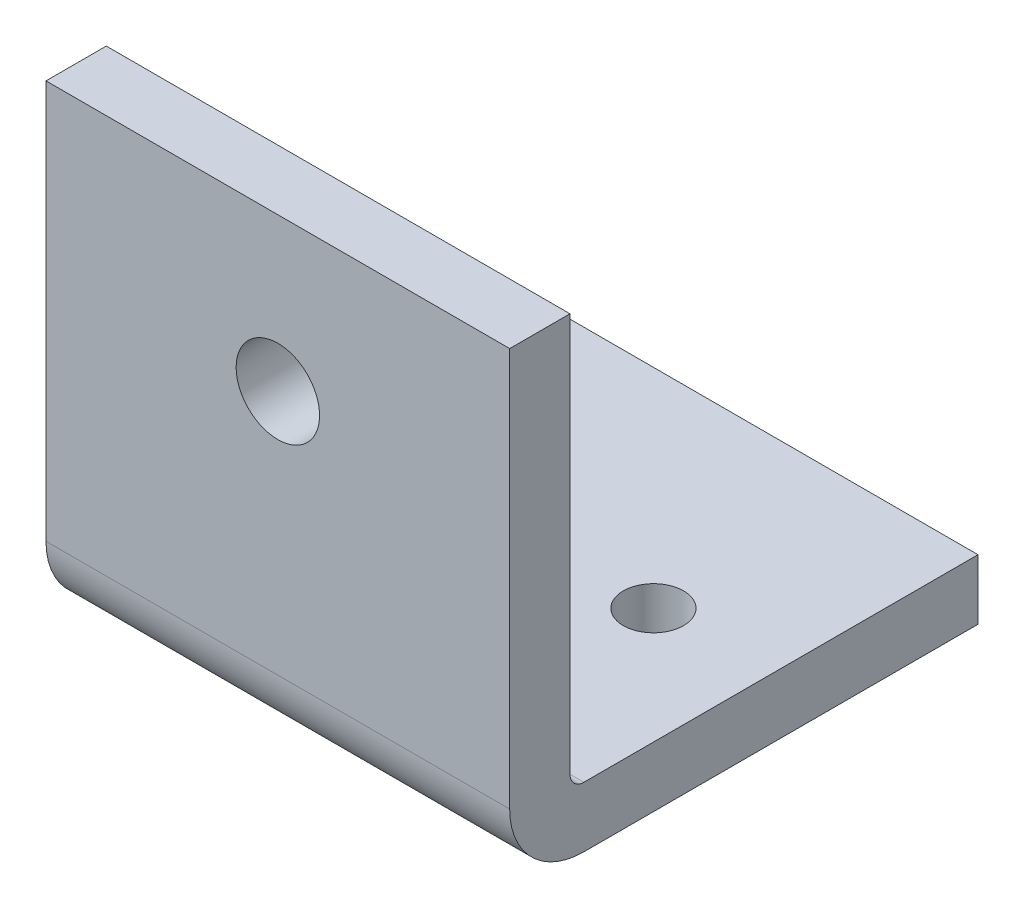
ISO-10303-21;
HEADER;
FILE_DESCRIPTION(('STEP AP214'),'2;1');
FILE_NAME('part.step','',(''),(''),'','','');
FILE_SCHEMA(('AUTOMOTIVE_DESIGN { 1 0 10303 214 1 1 1 1 }'));
ENDSEC;
DATA;
#1=APPLICATION_CONTEXT('core data for automotive mechanical design processes');
#2=APPLICATION_PROTOCOL_DEFINITION('international standard','automotive_design',2000,#1);
#3=PRODUCT_CONTEXT('',#1,'mechanical');
#4=PRODUCT('Part','Part','',(#3));
#5=PRODUCT_RELATED_PRODUCT_CATEGORY('part','',(#4));
#6=PRODUCT_DEFINITION_FORMATION('','',#4);
#7=PRODUCT_DEFINITION_CONTEXT('part definition',#1,'design');
#8=PRODUCT_DEFINITION('design','',#6,#7);
#9=PRODUCT_DEFINITION_SHAPE('','',#8);
#10=(LENGTH_UNIT() NAMED_UNIT(*) SI_UNIT(.MILLI.,.METRE.));
#11=(NAMED_UNIT(*) PLANE_ANGLE_UNIT() SI_UNIT($,.RADIAN.));
#12=(NAMED_UNIT(*) SI_UNIT($,.STERADIAN.) SOLID_ANGLE_UNIT());
#13=UNCERTAINTY_MEASURE_WITH_UNIT(LENGTH_MEASURE(1.E-05),#10,'distance_accuracy_value','');
#14=(GEOMETRIC_REPRESENTATION_CONTEXT(3) GLOBAL_UNCERTAINTY_ASSIGNED_CONTEXT((#13)) GLOBAL_UNIT_ASSIGNED_CONTEXT((#10,
#11,#12)) REPRESENTATION_CONTEXT('',''));
#15=CARTESIAN_POINT('',(0.,0.,0.));
#16=DIRECTION('',(0.,0.,1.));
#17=DIRECTION('',(1.,0.,0.));
#18=AXIS2_PLACEMENT_3D('',#15,#16,#17);
#19=CARTESIAN_POINT('',(50.,16.,-16.));
#20=DIRECTION('',(-1.,0.,0.));
#21=DIRECTION('',(0.,0.,1.));
#22=AXIS2_PLACEMENT_3D('',#19,#20,#21);
#23=CYLINDRICAL_SURFACE('',#22,3.);
#24=DIRECTION('',(-1.,0.,0.));
#25=VECTOR('',#24,1.);
#26=CARTESIAN_POINT('',(50.,13.,-16.));
#27=LINE('',#26,#25);
#28=CARTESIAN_POINT('',(22.5,13.,-16.));
#29=VERTEX_POINT('',#28);
#30=CARTESIAN_POINT('',(-22.5,13.,-16.));
#31=VERTEX_POINT('',#30);
#32=EDGE_CURVE('E322',#29,#31,#27,.T.);
#33=ORIENTED_EDGE('',*,*,#32,.T.);
#34=CARTESIAN_POINT('',(-22.5,16.,-16.));
#35=DIRECTION('',(-1.,0.,0.));
#36=DIRECTION('',(0.,0.,1.));
#37=AXIS2_PLACEMENT_3D('',#34,#35,#36);
#38=CIRCLE('',#37,3.);
#39=CARTESIAN_POINT('',(-22.5,16.,-13.));
#40=VERTEX_POINT('',#39);
#41=EDGE_CURVE('E153',#31,#40,#38,.T.);
#42=ORIENTED_EDGE('',*,*,#41,.T.);
#43=DIRECTION('',(-1.,0.,0.));
#44=VECTOR('',#43,1.);
#45=CARTESIAN_POINT('',(50.,16.,-13.));
#46=LINE('',#45,#44);
#47=CARTESIAN_POINT('',(22.5,16.,-13.));
#48=VERTEX_POINT('',#47);
#49=EDGE_CURVE('E318',#48,#40,#46,.T.);
#50=ORIENTED_EDGE('',*,*,#49,.F.);
#51=CARTESIAN_POINT('',(22.5,16.,-16.));
#52=DIRECTION('',(1.,0.,0.));
#53=DIRECTION('',(0.,0.,-1.));
#54=AXIS2_PLACEMENT_3D('',#51,#52,#53);
#55=CIRCLE('',#54,3.);
#56=EDGE_CURVE('E63',#48,#29,#55,.T.);
#57=ORIENTED_EDGE('',*,*,#56,.T.);
#58=EDGE_LOOP('',(#33,#42,#50,#57));
#59=FACE_BOUND('',#58,.T.);
#60=ADVANCED_FACE('F39',(#59),#23,.F.);
#61=CARTESIAN_POINT('',(-27.5,16.,-16.));
#62=DIRECTION('',(-1.,0.,0.));
#63=DIRECTION('',(0.,0.,1.));
#64=AXIS2_PLACEMENT_3D('',#61,#62,#63);
#65=CIRCLE('',#64,3.);
#66=CARTESIAN_POINT('',(-27.5,13.,-16.));
#67=VERTEX_POINT('',#66);
#68=CARTESIAN_POINT('',(-27.5,16.,-13.));
#69=VERTEX_POINT('',#68);
#70=EDGE_CURVE('E340',#67,#69,#65,.T.);
#71=ORIENTED_EDGE('',*,*,#70,.F.);
#72=CARTESIAN_POINT('',(-50.,13.,-16.));
#73=VERTEX_POINT('',#72);
#74=EDGE_CURVE('E317',#67,#73,#27,.T.);
#75=ORIENTED_EDGE('',*,*,#74,.T.);
#76=CARTESIAN_POINT('',(-50.,16.,-16.));
#77=DIRECTION('',(1.,0.,0.));
#78=DIRECTION('',(0.,0.,-1.));
#79=AXIS2_PLACEMENT_3D('',#76,#77,#78);
#80=CIRCLE('',#79,3.);
#81=CARTESIAN_POINT('',(-50.,16.,-13.));
#82=VERTEX_POINT('',#81);
#83=EDGE_CURVE('E282',#82,#73,#80,.T.);
#84=ORIENTED_EDGE('',*,*,#83,.F.);
#85=EDGE_CURVE('E312',#69,#82,#46,.T.);
#86=ORIENTED_EDGE('',*,*,#85,.F.);
#87=EDGE_LOOP('',(#71,#75,#84,#86));
#88=FACE_BOUND('',#87,.T.);
#89=ADVANCED_FACE('F339',(#88),#23,.F.);
#90=CARTESIAN_POINT('',(50.,0.,-16.));
#91=DIRECTION('',(0.,1.,0.));
#92=DIRECTION('',(0.,0.,1.));
#93=AXIS2_PLACEMENT_3D('',#90,#91,#92);
#94=PLANE('',#93);
#95=DIRECTION('',(-1.,0.,0.));
#96=VECTOR('',#95,1.);
#97=CARTESIAN_POINT('',(50.,0.,-16.));
#98=LINE('',#97,#96);
#99=CARTESIAN_POINT('',(50.,0.,-16.));
#100=VERTEX_POINT('',#99);
#101=CARTESIAN_POINT('',(-50.,0.,-16.));
#102=VERTEX_POINT('',#101);
#103=EDGE_CURVE('E270',#100,#102,#98,.T.);
#104=ORIENTED_EDGE('',*,*,#103,.T.);
#105=DIRECTION('',(0.,0.,-1.));
#106=VECTOR('',#105,1.);
#107=CARTESIAN_POINT('',(-50.,0.,-16.));
#108=LINE('',#107,#106);
#109=CARTESIAN_POINT('',(-50.,0.,-101.));
#110=VERTEX_POINT('',#109);
#111=EDGE_CURVE('E228',#102,#110,#108,.T.);
#112=ORIENTED_EDGE('',*,*,#111,.T.);
#113=DIRECTION('',(-1.,0.,0.));
#114=VECTOR('',#113,1.);
#115=CARTESIAN_POINT('',(50.,0.,-101.));
#116=LINE('',#115,#114);
#117=CARTESIAN_POINT('',(50.,0.,-101.));
#118=VERTEX_POINT('',#117);
#119=EDGE_CURVE('E11',#118,#110,#116,.T.);
#120=ORIENTED_EDGE('',*,*,#119,.F.);
#121=DIRECTION('',(0.,0.,-1.));
#122=VECTOR('',#121,1.);
#123=CARTESIAN_POINT('',(50.,0.,-16.));
#124=LINE('',#123,#122);
#125=EDGE_CURVE('E240',#100,#118,#124,.T.);
#126=ORIENTED_EDGE('',*,*,#125,.F.);
#127=EDGE_LOOP('',(#104,#112,#120,#126));
#128=FACE_BOUND('',#127,.T.);
#129=CARTESIAN_POINT('',(-25.,0.,-56.));
#130=DIRECTION('',(0.,1.,0.));
#131=DIRECTION('',(0.,0.,1.));
#132=AXIS2_PLACEMENT_3D('',#129,#130,#131);
#133=CIRCLE('',#132,6.5);
#134=CARTESIAN_POINT('',(-25.,0.,-49.5));
#135=VERTEX_POINT('',#134);
#136=EDGE_CURVE('E224',#135,#135,#133,.T.);
#137=ORIENTED_EDGE('',*,*,#136,.T.);
#138=EDGE_LOOP('',(#137));
#139=FACE_BOUND('',#138,.T.);
#140=CARTESIAN_POINT('',(25.,0.,-56.));
#141=DIRECTION('',(0.,1.,0.));
#142=DIRECTION('',(0.,0.,1.));
#143=AXIS2_PLACEMENT_3D('',#140,#141,#142);
#144=CIRCLE('',#143,6.5);
#145=CARTESIAN_POINT('',(25.,0.,-49.5));
#146=VERTEX_POINT('',#145);
#147=EDGE_CURVE('E233',#146,#146,#144,.T.);
#148=ORIENTED_EDGE('',*,*,#147,.T.);
#149=EDGE_LOOP('',(#148));
#150=FACE_BOUND('',#149,.T.);
#151=ADVANCED_FACE('F41',(#128,#139,#150),#94,.F.);
#152=CARTESIAN_POINT('',(50.,13.,-101.));
#153=DIRECTION('',(0.,0.,-1.));
#154=DIRECTION('',(-1.,0.,0.));
#155=AXIS2_PLACEMENT_3D('',#152,#153,#154);
#156=PLANE('',#155);
#157=DIRECTION('',(0.,-1.,0.));
#158=VECTOR('',#157,1.);
#159=CARTESIAN_POINT('',(-50.,13.,-101.));
#160=LINE('',#159,#158);
#161=CARTESIAN_POINT('',(-50.,13.,-101.));
#162=VERTEX_POINT('',#161);
#163=EDGE_CURVE('E274',#162,#110,#160,.T.);
#164=ORIENTED_EDGE('',*,*,#163,.F.);
#165=DIRECTION('',(-1.,0.,0.));
#166=VECTOR('',#165,1.);
#167=CARTESIAN_POINT('',(50.,13.,-101.));
#168=LINE('',#167,#166);
#169=CARTESIAN_POINT('',(50.,13.,-101.));
#170=VERTEX_POINT('',#169);
#171=EDGE_CURVE('E48',#170,#162,#168,.T.);
#172=ORIENTED_EDGE('',*,*,#171,.F.);
#173=DIRECTION('',(0.,-1.,0.));
#174=VECTOR('',#173,1.);
#175=CARTESIAN_POINT('',(50.,13.,-101.));
#176=LINE('',#175,#174);
#177=EDGE_CURVE('E243',#170,#118,#176,.T.);
#178=ORIENTED_EDGE('',*,*,#177,.T.);
#179=ORIENTED_EDGE('',*,*,#119,.T.);
#180=EDGE_LOOP('',(#164,#172,#178,#179));
#181=FACE_BOUND('',#180,.T.);
#182=ADVANCED_FACE('F329',(#181),#156,.T.);
#183=CARTESIAN_POINT('',(50.,13.,-16.));
#184=DIRECTION('',(0.,1.,0.));
#185=DIRECTION('',(0.,0.,1.));
#186=AXIS2_PLACEMENT_3D('',#183,#184,#185);
#187=PLANE('',#186);
#188=DIRECTION('',(0.,0.,1.));
#189=VECTOR('',#188,1.);
#190=CARTESIAN_POINT('',(-27.5,13.,-16.));
#191=LINE('',#190,#189);
#192=CARTESIAN_POINT('',(-27.5,13.,-33.));
#193=VERTEX_POINT('',#192);
#194=EDGE_CURVE('E176',#193,#67,#191,.T.);
#195=ORIENTED_EDGE('',*,*,#194,.F.);
#196=DIRECTION('',(-1.,0.,0.));
#197=VECTOR('',#196,1.);
#198=CARTESIAN_POINT('',(50.,13.,-33.));
#199=LINE('',#198,#197);
#200=CARTESIAN_POINT('',(-22.5,13.,-33.));
#201=VERTEX_POINT('',#200);
#202=EDGE_CURVE('E164',#201,#193,#199,.T.);
#203=ORIENTED_EDGE('',*,*,#202,.F.);
#204=DIRECTION('',(0.,0.,1.));
#205=VECTOR('',#204,1.);
#206=CARTESIAN_POINT('',(-22.5,13.,-16.));
#207=LINE('',#206,#205);
#208=EDGE_CURVE('E150',#201,#31,#207,.T.);
#209=ORIENTED_EDGE('',*,*,#208,.T.);
#210=ORIENTED_EDGE('',*,*,#32,.F.);
#211=DIRECTION('',(0.,0.,-1.));
#212=VECTOR('',#211,1.);
#213=CARTESIAN_POINT('',(22.5,13.,-16.));
#214=LINE('',#213,#212);
#215=CARTESIAN_POINT('',(22.5,13.,-33.));
#216=VERTEX_POINT('',#215);
#217=EDGE_CURVE('E196',#29,#216,#214,.T.);
#218=ORIENTED_EDGE('',*,*,#217,.T.);
#219=DIRECTION('',(1.,0.,0.));
#220=VECTOR('',#219,1.);
#221=CARTESIAN_POINT('',(50.,13.,-33.));
#222=LINE('',#221,#220);
#223=CARTESIAN_POINT('',(27.5,13.,-33.));
#224=VERTEX_POINT('',#223);
#225=EDGE_CURVE('E212',#224,#216,#222,.F.);
#226=ORIENTED_EDGE('',*,*,#225,.F.);
#227=DIRECTION('',(0.,0.,-1.));
#228=VECTOR('',#227,1.);
#229=CARTESIAN_POINT('',(27.5,13.,-16.));
#230=LINE('',#229,#228);
#231=CARTESIAN_POINT('',(27.5,13.,-16.));
#232=VERTEX_POINT('',#231);
#233=EDGE_CURVE('E206',#232,#224,#230,.T.);
#234=ORIENTED_EDGE('',*,*,#233,.F.);
#235=CARTESIAN_POINT('',(50.,13.,-16.));
#236=VERTEX_POINT('',#235);
#237=EDGE_CURVE('E319',#236,#232,#27,.T.);
#238=ORIENTED_EDGE('',*,*,#237,.F.);
#239=DIRECTION('',(0.,0.,-1.));
#240=VECTOR('',#239,1.);
#241=CARTESIAN_POINT('',(50.,13.,-16.));
#242=LINE('',#241,#240);
#243=EDGE_CURVE('E248',#236,#170,#242,.T.);
#244=ORIENTED_EDGE('',*,*,#243,.T.);
#245=ORIENTED_EDGE('',*,*,#171,.T.);
#246=DIRECTION('',(0.,0.,-1.));
#247=VECTOR('',#246,1.);
#248=CARTESIAN_POINT('',(-50.,13.,-16.));
#249=LINE('',#248,#247);
#250=EDGE_CURVE('E278',#73,#162,#249,.T.);
#251=ORIENTED_EDGE('',*,*,#250,.F.);
#252=ORIENTED_EDGE('',*,*,#74,.F.);
#253=EDGE_LOOP('',(#195,#203,#209,#210,#218,#226,#234,#238,#244,#245,#251,#252));
#254=FACE_BOUND('',#253,.T.);
#255=CARTESIAN_POINT('',(-25.,13.,-56.));
#256=DIRECTION('',(0.,1.,0.));
#257=DIRECTION('',(0.,0.,1.));
#258=AXIS2_PLACEMENT_3D('',#255,#256,#257);
#259=CIRCLE('',#258,6.5);
#260=CARTESIAN_POINT('',(-25.,13.,-49.5));
#261=VERTEX_POINT('',#260);
#262=EDGE_CURVE('E229',#261,#261,#259,.T.);
#263=ORIENTED_EDGE('',*,*,#262,.F.);
#264=EDGE_LOOP('',(#263));
#265=FACE_BOUND('',#264,.T.);
#266=CARTESIAN_POINT('',(25.,13.,-56.));
#267=DIRECTION('',(0.,1.,0.));
#268=DIRECTION('',(0.,0.,1.));
#269=AXIS2_PLACEMENT_3D('',#266,#267,#268);
#270=CIRCLE('',#269,6.5);
#271=CARTESIAN_POINT('',(25.,13.,-49.5));
#272=VERTEX_POINT('',#271);
#273=EDGE_CURVE('E220',#272,#272,#270,.T.);
#274=ORIENTED_EDGE('',*,*,#273,.F.);
#275=EDGE_LOOP('',(#274));
#276=FACE_BOUND('',#275,.T.);
#277=ADVANCED_FACE('F173',(#254,#265,#276),#187,.T.);
#278=CARTESIAN_POINT('',(27.5,16.,-16.));
#279=DIRECTION('',(1.,0.,0.));
#280=DIRECTION('',(0.,0.,-1.));
#281=AXIS2_PLACEMENT_3D('',#278,#279,#280);
#282=CIRCLE('',#281,3.);
#283=CARTESIAN_POINT('',(27.5,16.,-13.));
#284=VERTEX_POINT('',#283);
#285=EDGE_CURVE('E203',#284,#232,#282,.T.);
#286=ORIENTED_EDGE('',*,*,#285,.F.);
#287=CARTESIAN_POINT('',(50.,16.,-13.));
#288=VERTEX_POINT('',#287);
#289=EDGE_CURVE('E313',#288,#284,#46,.T.);
#290=ORIENTED_EDGE('',*,*,#289,.F.);
#291=CARTESIAN_POINT('',(50.,16.,-16.));
#292=DIRECTION('',(1.,0.,0.));
#293=DIRECTION('',(0.,0.,-1.));
#294=AXIS2_PLACEMENT_3D('',#291,#292,#293);
#295=CIRCLE('',#294,3.);
#296=EDGE_CURVE('E252',#288,#236,#295,.T.);
#297=ORIENTED_EDGE('',*,*,#296,.T.);
#298=ORIENTED_EDGE('',*,*,#237,.T.);
#299=EDGE_LOOP('',(#286,#290,#297,#298));
#300=FACE_BOUND('',#299,.T.);
#301=ADVANCED_FACE('F363',(#300),#23,.F.);
#302=CARTESIAN_POINT('',(50.,102.,-13.));
#303=DIRECTION('',(0.,0.,-1.));
#304=DIRECTION('',(0.,1.,0.));
#305=AXIS2_PLACEMENT_3D('',#302,#303,#304);
#306=PLANE('',#305);
#307=DIRECTION('',(0.,1.,0.));
#308=VECTOR('',#307,1.);
#309=CARTESIAN_POINT('',(-27.5,102.,-13.));
#310=LINE('',#309,#308);
#311=CARTESIAN_POINT('',(-27.5,33.,-13.));
#312=VERTEX_POINT('',#311);
#313=EDGE_CURVE('E159',#69,#312,#310,.T.);
#314=ORIENTED_EDGE('',*,*,#313,.F.);
#315=ORIENTED_EDGE('',*,*,#85,.T.);
#316=DIRECTION('',(0.,-1.,0.));
#317=VECTOR('',#316,1.);
#318=CARTESIAN_POINT('',(-50.,102.,-13.));
#319=LINE('',#318,#317);
#320=CARTESIAN_POINT('',(-50.,102.,-13.));
#321=VERTEX_POINT('',#320);
#322=EDGE_CURVE('E286',#321,#82,#319,.T.);
#323=ORIENTED_EDGE('',*,*,#322,.F.);
#324=DIRECTION('',(-1.,0.,0.));
#325=VECTOR('',#324,1.);
#326=CARTESIAN_POINT('',(50.,102.,-13.));
#327=LINE('',#326,#325);
#328=CARTESIAN_POINT('',(50.,102.,-13.));
#329=VERTEX_POINT('',#328);
#330=EDGE_CURVE('E309',#329,#321,#327,.T.);
#331=ORIENTED_EDGE('',*,*,#330,.F.);
#332=DIRECTION('',(0.,-1.,0.));
#333=VECTOR('',#332,1.);
#334=CARTESIAN_POINT('',(50.,102.,-13.));
#335=LINE('',#334,#333);
#336=EDGE_CURVE('E256',#329,#288,#335,.T.);
#337=ORIENTED_EDGE('',*,*,#336,.T.);
#338=ORIENTED_EDGE('',*,*,#289,.T.);
#339=DIRECTION('',(0.,-1.,0.));
#340=VECTOR('',#339,1.);
#341=CARTESIAN_POINT('',(27.5,102.,-13.));
#342=LINE('',#341,#340);
#343=CARTESIAN_POINT('',(27.5,33.,-13.));
#344=VERTEX_POINT('',#343);
#345=EDGE_CURVE('E200',#344,#284,#342,.T.);
#346=ORIENTED_EDGE('',*,*,#345,.F.);
#347=DIRECTION('',(-1.,0.,0.));
#348=VECTOR('',#347,1.);
#349=CARTESIAN_POINT('',(50.,33.,-13.));
#350=LINE('',#349,#348);
#351=CARTESIAN_POINT('',(22.5,33.,-13.));
#352=VERTEX_POINT('',#351);
#353=EDGE_CURVE('E209',#352,#344,#350,.F.);
#354=ORIENTED_EDGE('',*,*,#353,.F.);
#355=DIRECTION('',(0.,-1.,0.));
#356=VECTOR('',#355,1.);
#357=CARTESIAN_POINT('',(22.5,102.,-13.));
#358=LINE('',#357,#356);
#359=EDGE_CURVE('E190',#352,#48,#358,.T.);
#360=ORIENTED_EDGE('',*,*,#359,.T.);
#361=ORIENTED_EDGE('',*,*,#49,.T.);
#362=DIRECTION('',(0.,1.,0.));
#363=VECTOR('',#362,1.);
#364=CARTESIAN_POINT('',(-22.5,102.,-13.));
#365=LINE('',#364,#363);
#366=CARTESIAN_POINT('',(-22.5,33.,-13.));
#367=VERTEX_POINT('',#366);
#368=EDGE_CURVE('E388',#40,#367,#365,.T.);
#369=ORIENTED_EDGE('',*,*,#368,.T.);
#370=DIRECTION('',(1.,0.,0.));
#371=VECTOR('',#370,1.);
#372=CARTESIAN_POINT('',(50.,33.,-13.));
#373=LINE('',#372,#371);
#374=EDGE_CURVE('E167',#312,#367,#373,.T.);
#375=ORIENTED_EDGE('',*,*,#374,.F.);
#376=EDGE_LOOP('',(#314,#315,#323,#331,#337,#338,#346,#354,#360,#361,#369,#375));
#377=FACE_BOUND('',#376,.T.);
#378=CARTESIAN_POINT('',(0.,69.,-13.));
#379=DIRECTION('',(0.,0.,-1.));
#380=DIRECTION('',(-1.,0.,0.));
#381=AXIS2_PLACEMENT_3D('',#378,#379,#380);
#382=CIRCLE('',#381,9.);
#383=CARTESIAN_POINT('',(-9.,69.,-13.));
#384=VERTEX_POINT('',#383);
#385=EDGE_CURVE('E215',#384,#384,#382,.T.);
#386=ORIENTED_EDGE('',*,*,#385,.F.);
#387=EDGE_LOOP('',(#386));
#388=FACE_BOUND('',#387,.T.);
#389=ADVANCED_FACE('F357',(#377,#388),#306,.T.);
#390=CARTESIAN_POINT('',(50.,102.,0.));
#391=DIRECTION('',(0.,1.,0.));
#392=DIRECTION('',(0.,0.,1.));
#393=AXIS2_PLACEMENT_3D('',#390,#391,#392);
#394=PLANE('',#393);
#395=DIRECTION('',(0.,0.,-1.));
#396=VECTOR('',#395,1.);
#397=CARTESIAN_POINT('',(-50.,102.,0.));
#398=LINE('',#397,#396);
#399=CARTESIAN_POINT('',(-50.,102.,0.));
#400=VERTEX_POINT('',#399);
#401=EDGE_CURVE('E290',#400,#321,#398,.T.);
#402=ORIENTED_EDGE('',*,*,#401,.F.);
#403=DIRECTION('',(-1.,0.,0.));
#404=VECTOR('',#403,1.);
#405=CARTESIAN_POINT('',(50.,102.,0.));
#406=LINE('',#405,#404);
#407=CARTESIAN_POINT('',(50.,102.,0.));
#408=VERTEX_POINT('',#407);
#409=EDGE_CURVE('E306',#408,#400,#406,.T.);
#410=ORIENTED_EDGE('',*,*,#409,.F.);
#411=DIRECTION('',(0.,0.,-1.));
#412=VECTOR('',#411,1.);
#413=CARTESIAN_POINT('',(50.,102.,0.));
#414=LINE('',#413,#412);
#415=EDGE_CURVE('E260',#408,#329,#414,.T.);
#416=ORIENTED_EDGE('',*,*,#415,.T.);
#417=ORIENTED_EDGE('',*,*,#330,.T.);
#418=EDGE_LOOP('',(#402,#410,#416,#417));
#419=FACE_BOUND('',#418,.T.);
#420=ADVANCED_FACE('F385',(#419),#394,.T.);
#421=CARTESIAN_POINT('',(50.,102.,0.));
#422=DIRECTION('',(0.,0.,-1.));
#423=DIRECTION('',(0.,1.,0.));
#424=AXIS2_PLACEMENT_3D('',#421,#422,#423);
#425=PLANE('',#424);
#426=DIRECTION('',(0.,-1.,0.));
#427=VECTOR('',#426,1.);
#428=CARTESIAN_POINT('',(-50.,102.,0.));
#429=LINE('',#428,#427);
#430=CARTESIAN_POINT('',(-50.,16.,0.));
#431=VERTEX_POINT('',#430);
#432=EDGE_CURVE('E294',#400,#431,#429,.T.);
#433=ORIENTED_EDGE('',*,*,#432,.T.);
#434=DIRECTION('',(-1.,0.,0.));
#435=VECTOR('',#434,1.);
#436=CARTESIAN_POINT('',(50.,16.,0.));
#437=LINE('',#436,#435);
#438=CARTESIAN_POINT('',(50.,16.,0.));
#439=VERTEX_POINT('',#438);
#440=EDGE_CURVE('E303',#439,#431,#437,.T.);
#441=ORIENTED_EDGE('',*,*,#440,.F.);
#442=DIRECTION('',(0.,-1.,0.));
#443=VECTOR('',#442,1.);
#444=CARTESIAN_POINT('',(50.,102.,0.));
#445=LINE('',#444,#443);
#446=EDGE_CURVE('E264',#408,#439,#445,.T.);
#447=ORIENTED_EDGE('',*,*,#446,.F.);
#448=ORIENTED_EDGE('',*,*,#409,.T.);
#449=EDGE_LOOP('',(#433,#441,#447,#448));
#450=FACE_BOUND('',#449,.T.);
#451=CARTESIAN_POINT('',(0.,69.,0.));
#452=DIRECTION('',(0.,0.,-1.));
#453=DIRECTION('',(-1.,0.,0.));
#454=AXIS2_PLACEMENT_3D('',#451,#452,#453);
#455=CIRCLE('',#454,9.);
#456=CARTESIAN_POINT('',(-9.,69.,0.));
#457=VERTEX_POINT('',#456);
#458=EDGE_CURVE('E216',#457,#457,#455,.T.);
#459=ORIENTED_EDGE('',*,*,#458,.T.);
#460=EDGE_LOOP('',(#459));
#461=FACE_BOUND('',#460,.T.);
#462=ADVANCED_FACE('F381',(#450,#461),#425,.F.);
#463=CARTESIAN_POINT('',(50.,16.,-16.));
#464=DIRECTION('',(-1.,0.,0.));
#465=DIRECTION('',(0.,0.,1.));
#466=AXIS2_PLACEMENT_3D('',#463,#464,#465);
#467=CYLINDRICAL_SURFACE('',#466,16.);
#468=CARTESIAN_POINT('',(-50.,16.,-16.));
#469=DIRECTION('',(1.,0.,0.));
#470=DIRECTION('',(0.,0.,-1.));
#471=AXIS2_PLACEMENT_3D('',#468,#469,#470);
#472=CIRCLE('',#471,16.);
#473=EDGE_CURVE('E244',#431,#102,#472,.T.);
#474=ORIENTED_EDGE('',*,*,#473,.T.);
#475=ORIENTED_EDGE('',*,*,#103,.F.);
#476=CARTESIAN_POINT('',(50.,16.,-16.));
#477=DIRECTION('',(1.,0.,0.));
#478=DIRECTION('',(0.,0.,-1.));
#479=AXIS2_PLACEMENT_3D('',#476,#477,#478);
#480=CIRCLE('',#479,16.);
#481=EDGE_CURVE('E267',#439,#100,#480,.T.);
#482=ORIENTED_EDGE('',*,*,#481,.F.);
#483=ORIENTED_EDGE('',*,*,#440,.T.);
#484=EDGE_LOOP('',(#474,#475,#482,#483));
#485=FACE_BOUND('',#484,.T.);
#486=ADVANCED_FACE('F377',(#485),#467,.T.);
#487=CARTESIAN_POINT('',(50.,16.,-16.));
#488=DIRECTION('',(1.,0.,0.));
#489=DIRECTION('',(0.,0.,-1.));
#490=AXIS2_PLACEMENT_3D('',#487,#488,#489);
#491=PLANE('',#490);
#492=ORIENTED_EDGE('',*,*,#125,.T.);
#493=ORIENTED_EDGE('',*,*,#177,.F.);
#494=ORIENTED_EDGE('',*,*,#243,.F.);
#495=ORIENTED_EDGE('',*,*,#296,.F.);
#496=ORIENTED_EDGE('',*,*,#336,.F.);
#497=ORIENTED_EDGE('',*,*,#415,.F.);
#498=ORIENTED_EDGE('',*,*,#446,.T.);
#499=ORIENTED_EDGE('',*,*,#481,.T.);
#500=EDGE_LOOP('',(#492,#493,#494,#495,#496,#497,#498,#499));
#501=FACE_BOUND('',#500,.T.);
#502=ADVANCED_FACE('F366',(#501),#491,.T.);
#503=CARTESIAN_POINT('',(-50.,16.,-16.));
#504=DIRECTION('',(1.,0.,0.));
#505=DIRECTION('',(0.,0.,-1.));
#506=AXIS2_PLACEMENT_3D('',#503,#504,#505);
#507=PLANE('',#506);
#508=ORIENTED_EDGE('',*,*,#111,.F.);
#509=ORIENTED_EDGE('',*,*,#473,.F.);
#510=ORIENTED_EDGE('',*,*,#432,.F.);
#511=ORIENTED_EDGE('',*,*,#401,.T.);
#512=ORIENTED_EDGE('',*,*,#322,.T.);
#513=ORIENTED_EDGE('',*,*,#83,.T.);
#514=ORIENTED_EDGE('',*,*,#250,.T.);
#515=ORIENTED_EDGE('',*,*,#163,.T.);
#516=EDGE_LOOP('',(#508,#509,#510,#511,#512,#513,#514,#515));
#517=FACE_BOUND('',#516,.T.);
#518=ADVANCED_FACE('F333',(#517),#507,.F.);
#519=CARTESIAN_POINT('',(25.,0.,-56.));
#520=DIRECTION('',(0.,1.,0.));
#521=DIRECTION('',(0.,0.,1.));
#522=AXIS2_PLACEMENT_3D('',#519,#520,#521);
#523=CYLINDRICAL_SURFACE('',#522,6.5);
#524=ORIENTED_EDGE('',*,*,#147,.F.);
#525=EDGE_LOOP('',(#524));
#526=FACE_BOUND('',#525,.T.);
#527=ORIENTED_EDGE('',*,*,#273,.T.);
#528=EDGE_LOOP('',(#527));
#529=FACE_BOUND('',#528,.T.);
#530=ADVANCED_FACE('F489',(#526,#529),#523,.F.);
#531=CARTESIAN_POINT('',(-25.,0.,-56.));
#532=DIRECTION('',(0.,1.,0.));
#533=DIRECTION('',(0.,0.,1.));
#534=AXIS2_PLACEMENT_3D('',#531,#532,#533);
#535=CYLINDRICAL_SURFACE('',#534,6.5);
#536=ORIENTED_EDGE('',*,*,#136,.F.);
#537=EDGE_LOOP('',(#536));
#538=FACE_BOUND('',#537,.T.);
#539=ORIENTED_EDGE('',*,*,#262,.T.);
#540=EDGE_LOOP('',(#539));
#541=FACE_BOUND('',#540,.T.);
#542=ADVANCED_FACE('F479',(#538,#541),#535,.F.);
#543=CARTESIAN_POINT('',(0.,69.,0.));
#544=DIRECTION('',(0.,0.,-1.));
#545=DIRECTION('',(-1.,0.,0.));
#546=AXIS2_PLACEMENT_3D('',#543,#544,#545);
#547=CYLINDRICAL_SURFACE('',#546,9.);
#548=ORIENTED_EDGE('',*,*,#458,.F.);
#549=EDGE_LOOP('',(#548));
#550=FACE_BOUND('',#549,.T.);
#551=ORIENTED_EDGE('',*,*,#385,.T.);
#552=EDGE_LOOP('',(#551));
#553=FACE_BOUND('',#552,.T.);
#554=ADVANCED_FACE('F464',(#550,#553),#547,.F.);
#555=CARTESIAN_POINT('',(25.,33.,-13.));
#556=DIRECTION('',(0.,-0.707106781186548,0.707106781186548));
#557=DIRECTION('',(0.,-0.707106781186548,-0.707106781186548));
#558=AXIS2_PLACEMENT_3D('',#555,#556,#557);
#559=PLANE('',#558);
#560=DIRECTION('',(0.,-0.707106781186548,-0.707106781186548));
#561=VECTOR('',#560,1.);
#562=CARTESIAN_POINT('',(27.5,33.,-13.));
#563=LINE('',#562,#561);
#564=EDGE_CURVE('E183',#344,#224,#563,.T.);
#565=ORIENTED_EDGE('',*,*,#564,.T.);
#566=ORIENTED_EDGE('',*,*,#225,.T.);
#567=DIRECTION('',(0.,-0.707106781186548,-0.707106781186548));
#568=VECTOR('',#567,1.);
#569=CARTESIAN_POINT('',(22.5,33.,-13.));
#570=LINE('',#569,#568);
#571=EDGE_CURVE('E178',#352,#216,#570,.T.);
#572=ORIENTED_EDGE('',*,*,#571,.F.);
#573=ORIENTED_EDGE('',*,*,#353,.T.);
#574=EDGE_LOOP('',(#565,#566,#572,#573));
#575=FACE_BOUND('',#574,.T.);
#576=ADVANCED_FACE('F352',(#575),#559,.F.);
#577=CARTESIAN_POINT('',(27.5,51.,-50.5));
#578=DIRECTION('',(1.,0.,0.));
#579=DIRECTION('',(0.,0.,-1.));
#580=AXIS2_PLACEMENT_3D('',#577,#578,#579);
#581=PLANE('',#580);
#582=ORIENTED_EDGE('',*,*,#285,.T.);
#583=ORIENTED_EDGE('',*,*,#233,.T.);
#584=ORIENTED_EDGE('',*,*,#564,.F.);
#585=ORIENTED_EDGE('',*,*,#345,.T.);
#586=EDGE_LOOP('',(#582,#583,#584,#585));
#587=FACE_BOUND('',#586,.T.);
#588=ADVANCED_FACE('F361',(#587),#581,.T.);
#589=CARTESIAN_POINT('',(22.5,51.,-50.5));
#590=DIRECTION('',(1.,0.,0.));
#591=DIRECTION('',(0.,0.,-1.));
#592=AXIS2_PLACEMENT_3D('',#589,#590,#591);
#593=PLANE('',#592);
#594=ORIENTED_EDGE('',*,*,#217,.F.);
#595=ORIENTED_EDGE('',*,*,#56,.F.);
#596=ORIENTED_EDGE('',*,*,#359,.F.);
#597=ORIENTED_EDGE('',*,*,#571,.T.);
#598=EDGE_LOOP('',(#594,#595,#596,#597));
#599=FACE_BOUND('',#598,.T.);
#600=ADVANCED_FACE('F348',(#599),#593,.F.);
#601=CARTESIAN_POINT('',(-25.,33.,-13.));
#602=DIRECTION('',(0.,0.707106781186548,-0.707106781186548));
#603=DIRECTION('',(0.,-0.707106781186548,-0.707106781186548));
#604=AXIS2_PLACEMENT_3D('',#601,#602,#603);
#605=PLANE('',#604);
#606=DIRECTION('',(0.,-0.707106781186548,-0.707106781186548));
#607=VECTOR('',#606,1.);
#608=CARTESIAN_POINT('',(-22.5,33.,-13.));
#609=LINE('',#608,#607);
#610=EDGE_CURVE('E55',#367,#201,#609,.T.);
#611=ORIENTED_EDGE('',*,*,#610,.T.);
#612=ORIENTED_EDGE('',*,*,#202,.T.);
#613=DIRECTION('',(0.,-0.707106781186548,-0.707106781186548));
#614=VECTOR('',#613,1.);
#615=CARTESIAN_POINT('',(-27.5,33.,-13.));
#616=LINE('',#615,#614);
#617=EDGE_CURVE('E170',#312,#193,#616,.T.);
#618=ORIENTED_EDGE('',*,*,#617,.F.);
#619=ORIENTED_EDGE('',*,*,#374,.T.);
#620=EDGE_LOOP('',(#611,#612,#618,#619));
#621=FACE_BOUND('',#620,.T.);
#622=ADVANCED_FACE('F162',(#621),#605,.T.);
#623=CARTESIAN_POINT('',(-27.5,51.,-50.5));
#624=DIRECTION('',(-1.,0.,0.));
#625=DIRECTION('',(0.,0.,1.));
#626=AXIS2_PLACEMENT_3D('',#623,#624,#625);
#627=PLANE('',#626);
#628=ORIENTED_EDGE('',*,*,#617,.T.);
#629=ORIENTED_EDGE('',*,*,#194,.T.);
#630=ORIENTED_EDGE('',*,*,#70,.T.);
#631=ORIENTED_EDGE('',*,*,#313,.T.);
#632=EDGE_LOOP('',(#628,#629,#630,#631));
#633=FACE_BOUND('',#632,.T.);
#634=ADVANCED_FACE('F401',(#633),#627,.T.);
#635=CARTESIAN_POINT('',(-22.5,51.,-50.5));
#636=DIRECTION('',(-1.,0.,0.));
#637=DIRECTION('',(0.,0.,1.));
#638=AXIS2_PLACEMENT_3D('',#635,#636,#637);
#639=PLANE('',#638);
#640=ORIENTED_EDGE('',*,*,#208,.F.);
#641=ORIENTED_EDGE('',*,*,#610,.F.);
#642=ORIENTED_EDGE('',*,*,#368,.F.);
#643=ORIENTED_EDGE('',*,*,#41,.F.);
#644=EDGE_LOOP('',(#640,#641,#642,#643));
#645=FACE_BOUND('',#644,.T.);
#646=ADVANCED_FACE('F151',(#645),#639,.F.);
#647=CLOSED_SHELL('',(#60,#89,#151,#182,#277,#301,#389,#420,#462,#486,#502,#518,#530,#542,#554,
#576,#588,#600,#622,#634,#646));
#648=MANIFOLD_SOLID_BREP('B2',#647);
#649=ADVANCED_BREP_SHAPE_REPRESENTATION('',(#18,#648),#14);
#650=SHAPE_DEFINITION_REPRESENTATION(#9,#649);
ENDSEC;
END-ISO-10303-21;
